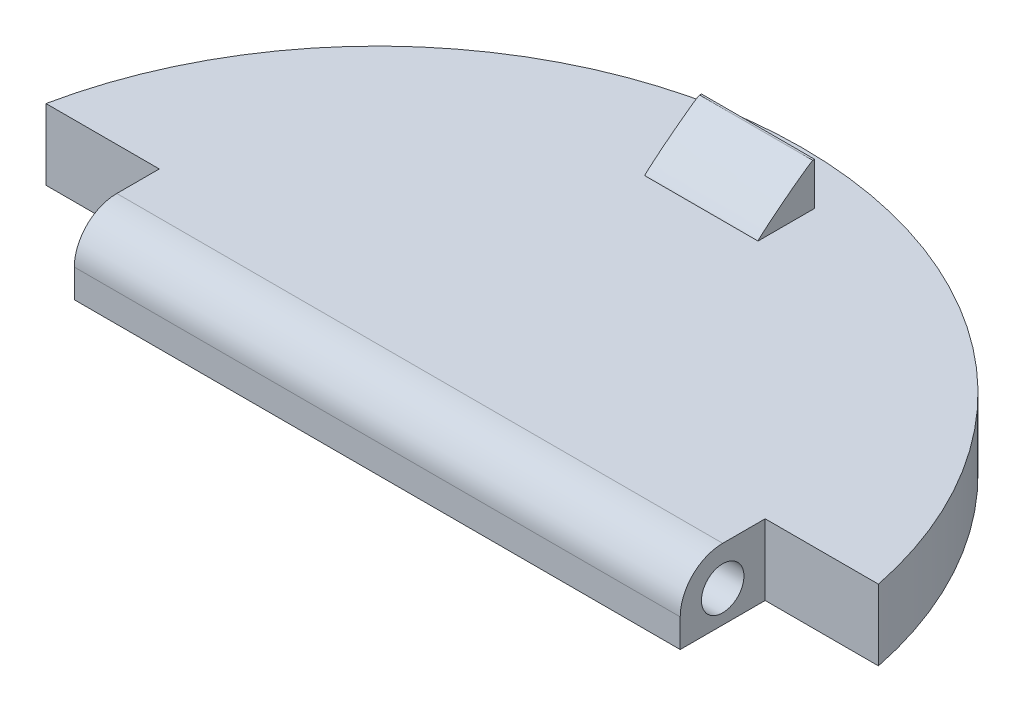
ISO-10303-21;
HEADER;
FILE_DESCRIPTION(('STEP AP214'),'2;1');
FILE_NAME('part.step','',(''),(''),'','','');
FILE_SCHEMA(('AUTOMOTIVE_DESIGN { 1 0 10303 214 1 1 1 1 }'));
ENDSEC;
DATA;
#1=APPLICATION_CONTEXT('core data for automotive mechanical design processes');
#2=APPLICATION_PROTOCOL_DEFINITION('international standard','automotive_design',2000,#1);
#3=PRODUCT_CONTEXT('',#1,'mechanical');
#4=PRODUCT('Part','Part','',(#3));
#5=PRODUCT_RELATED_PRODUCT_CATEGORY('part','',(#4));
#6=PRODUCT_DEFINITION_FORMATION('','',#4);
#7=PRODUCT_DEFINITION_CONTEXT('part definition',#1,'design');
#8=PRODUCT_DEFINITION('design','',#6,#7);
#9=PRODUCT_DEFINITION_SHAPE('','',#8);
#10=(LENGTH_UNIT() NAMED_UNIT(*) SI_UNIT(.MILLI.,.METRE.));
#11=(NAMED_UNIT(*) PLANE_ANGLE_UNIT() SI_UNIT($,.RADIAN.));
#12=(NAMED_UNIT(*) SI_UNIT($,.STERADIAN.) SOLID_ANGLE_UNIT());
#13=UNCERTAINTY_MEASURE_WITH_UNIT(LENGTH_MEASURE(1.E-05),#10,'distance_accuracy_value','');
#14=(GEOMETRIC_REPRESENTATION_CONTEXT(3) GLOBAL_UNCERTAINTY_ASSIGNED_CONTEXT((#13)) GLOBAL_UNIT_ASSIGNED_CONTEXT((#10,
#11,#12)) REPRESENTATION_CONTEXT('',''));
#15=CARTESIAN_POINT('',(0.,0.,0.));
#16=DIRECTION('',(0.,0.,1.));
#17=DIRECTION('',(1.,0.,0.));
#18=AXIS2_PLACEMENT_3D('',#15,#16,#17);
#19=CARTESIAN_POINT('',(0.,5.,0.));
#20=DIRECTION('',(0.,1.,0.));
#21=DIRECTION('',(0.,0.,1.));
#22=AXIS2_PLACEMENT_3D('',#19,#20,#21);
#23=PLANE('',#22);
#24=DIRECTION('',(0.,0.,-1.));
#25=VECTOR('',#24,1.);
#26=CARTESIAN_POINT('',(-21.3938769133982,5.,0.));
#27=LINE('',#26,#25);
#28=CARTESIAN_POINT('',(-21.3938769133982,5.,-3.));
#29=VERTEX_POINT('',#28);
#30=CARTESIAN_POINT('',(-21.3938769133982,5.,-6.));
#31=VERTEX_POINT('',#30);
#32=EDGE_CURVE('E125',#29,#31,#27,.T.);
#33=ORIENTED_EDGE('',*,*,#32,.F.);
#34=DIRECTION('',(1.,0.,0.));
#35=VECTOR('',#34,1.);
#36=CARTESIAN_POINT('',(21.3938769133982,5.,-3.));
#37=LINE('',#36,#35);
#38=CARTESIAN_POINT('',(21.3938769133982,5.,-3.));
#39=VERTEX_POINT('',#38);
#40=EDGE_CURVE('E241',#29,#39,#37,.T.);
#41=ORIENTED_EDGE('',*,*,#40,.T.);
#42=DIRECTION('',(0.,0.,1.));
#43=VECTOR('',#42,1.);
#44=CARTESIAN_POINT('',(21.3938769133982,5.,0.));
#45=LINE('',#44,#43);
#46=CARTESIAN_POINT('',(21.3938769133982,5.,-6.));
#47=VERTEX_POINT('',#46);
#48=EDGE_CURVE('E167',#47,#39,#45,.T.);
#49=ORIENTED_EDGE('',*,*,#48,.F.);
#50=DIRECTION('',(-1.,0.,0.));
#51=VECTOR('',#50,1.);
#52=CARTESIAN_POINT('',(21.3938769133982,5.,-6.));
#53=LINE('',#52,#51);
#54=CARTESIAN_POINT('',(29.3938769133982,5.,-6.));
#55=VERTEX_POINT('',#54);
#56=EDGE_CURVE('E163',#55,#47,#53,.T.);
#57=ORIENTED_EDGE('',*,*,#56,.F.);
#58=CARTESIAN_POINT('',(0.,5.,0.));
#59=DIRECTION('',(0.,1.,0.));
#60=DIRECTION('',(0.,0.,1.));
#61=AXIS2_PLACEMENT_3D('',#58,#59,#60);
#62=CIRCLE('',#61,30.);
#63=CARTESIAN_POINT('',(-29.3938769133982,5.,-6.));
#64=VERTEX_POINT('',#63);
#65=EDGE_CURVE('E153',#55,#64,#62,.T.);
#66=ORIENTED_EDGE('',*,*,#65,.T.);
#67=DIRECTION('',(-1.,0.,0.));
#68=VECTOR('',#67,1.);
#69=CARTESIAN_POINT('',(-21.3938769133982,5.,-6.));
#70=LINE('',#69,#68);
#71=EDGE_CURVE('E136',#31,#64,#70,.T.);
#72=ORIENTED_EDGE('',*,*,#71,.F.);
#73=EDGE_LOOP('',(#33,#41,#49,#57,#66,#72));
#74=FACE_BOUND('',#73,.T.);
#75=DIRECTION('',(-1.,0.,0.));
#76=VECTOR('',#75,1.);
#77=CARTESIAN_POINT('',(-3.84159331598207,5.,-26.7316665793187));
#78=LINE('',#77,#76);
#79=CARTESIAN_POINT('',(4.15840668401793,5.,-26.7316665793187));
#80=VERTEX_POINT('',#79);
#81=CARTESIAN_POINT('',(-3.84159331598207,5.,-26.7316665793187));
#82=VERTEX_POINT('',#81);
#83=EDGE_CURVE('E200',#80,#82,#78,.T.);
#84=ORIENTED_EDGE('',*,*,#83,.F.);
#85=DIRECTION('',(0.,0.,-1.));
#86=VECTOR('',#85,1.);
#87=CARTESIAN_POINT('',(4.15840668401793,5.,-26.7316665793187));
#88=LINE('',#87,#86);
#89=CARTESIAN_POINT('',(4.15840668401793,5.,-22.7316665793187));
#90=VERTEX_POINT('',#89);
#91=EDGE_CURVE('E161',#90,#80,#88,.T.);
#92=ORIENTED_EDGE('',*,*,#91,.F.);
#93=CARTESIAN_POINT('',(-4.24159331598207,5.,-22.7316665793187));
#94=CARTESIAN_POINT('',(-1.30825998264874,5.,-22.7316665793187));
#95=CARTESIAN_POINT('',(1.6250733506846,5.,-22.7316665793187));
#96=CARTESIAN_POINT('',(4.55840668401793,5.,-22.7316665793187));
#97=(BOUNDED_CURVE() B_SPLINE_CURVE(3,(#93,#94,#95,#96),.UNSPECIFIED.,.F.,
.F.) B_SPLINE_CURVE_WITH_KNOTS((4,4),(-0.00455840668401793,0.00424159331598207),
.UNSPECIFIED.) CURVE() GEOMETRIC_REPRESENTATION_ITEM() RATIONAL_B_SPLINE_CURVE((1.,1.,1.,1.)) REPRESENTATION_ITEM(''));
#98=CARTESIAN_POINT('',(-3.84159331598207,5.,-22.7316665793187));
#99=VERTEX_POINT('',#98);
#100=EDGE_CURVE('E188',#99,#90,#97,.T.);
#101=ORIENTED_EDGE('',*,*,#100,.F.);
#102=DIRECTION('',(0.,0.,1.));
#103=VECTOR('',#102,1.);
#104=CARTESIAN_POINT('',(-3.84159331598207,5.,-26.7316665793187));
#105=LINE('',#104,#103);
#106=EDGE_CURVE('E203',#82,#99,#105,.T.);
#107=ORIENTED_EDGE('',*,*,#106,.F.);
#108=EDGE_LOOP('',(#84,#92,#101,#107));
#109=FACE_BOUND('',#108,.T.);
#110=ADVANCED_FACE('F44',(#74,#109),#23,.T.);
#111=CARTESIAN_POINT('',(0.,5.,0.));
#112=DIRECTION('',(0.,-1.,0.));
#113=DIRECTION('',(0.,0.,-1.));
#114=AXIS2_PLACEMENT_3D('',#111,#112,#113);
#115=CYLINDRICAL_SURFACE('',#114,30.);
#116=CARTESIAN_POINT('',(0.,0.,0.));
#117=DIRECTION('',(0.,1.,0.));
#118=DIRECTION('',(0.,0.,1.));
#119=AXIS2_PLACEMENT_3D('',#116,#117,#118);
#120=CIRCLE('',#119,30.);
#121=CARTESIAN_POINT('',(29.3938769133982,0.,-6.));
#122=VERTEX_POINT('',#121);
#123=CARTESIAN_POINT('',(-29.3938769133982,0.,-6.));
#124=VERTEX_POINT('',#123);
#125=EDGE_CURVE('E210',#122,#124,#120,.T.);
#126=ORIENTED_EDGE('',*,*,#125,.T.);
#127=DIRECTION('',(0.,1.,0.));
#128=VECTOR('',#127,1.);
#129=CARTESIAN_POINT('',(-29.3938769133982,-5.,-6.));
#130=LINE('',#129,#128);
#131=EDGE_CURVE('E146',#124,#64,#130,.T.);
#132=ORIENTED_EDGE('',*,*,#131,.T.);
#133=ORIENTED_EDGE('',*,*,#65,.F.);
#134=DIRECTION('',(0.,1.,0.));
#135=VECTOR('',#134,1.);
#136=CARTESIAN_POINT('',(29.3938769133982,-5.,-6.));
#137=LINE('',#136,#135);
#138=EDGE_CURVE('E171',#122,#55,#137,.T.);
#139=ORIENTED_EDGE('',*,*,#138,.F.);
#140=EDGE_LOOP('',(#126,#132,#133,#139));
#141=FACE_BOUND('',#140,.T.);
#142=ADVANCED_FACE('F251',(#141),#115,.T.);
#143=CARTESIAN_POINT('',(-30.,5.,0.));
#144=DIRECTION('',(0.,0.,-1.));
#145=DIRECTION('',(-1.,0.,0.));
#146=AXIS2_PLACEMENT_3D('',#143,#144,#145);
#147=PLANE('',#146);
#148=DIRECTION('',(0.,1.,0.));
#149=VECTOR('',#148,1.);
#150=CARTESIAN_POINT('',(21.3938769133982,-5.,0.));
#151=LINE('',#150,#149);
#152=CARTESIAN_POINT('',(21.3938769133982,0.,0.));
#153=VERTEX_POINT('',#152);
#154=CARTESIAN_POINT('',(21.3938769133982,2.,0.));
#155=VERTEX_POINT('',#154);
#156=EDGE_CURVE('E137',#153,#155,#151,.T.);
#157=ORIENTED_EDGE('',*,*,#156,.T.);
#158=DIRECTION('',(1.,0.,0.));
#159=VECTOR('',#158,1.);
#160=CARTESIAN_POINT('',(-21.3938769133982,2.,0.));
#161=LINE('',#160,#159);
#162=CARTESIAN_POINT('',(-21.3938769133982,2.,0.));
#163=VERTEX_POINT('',#162);
#164=EDGE_CURVE('E52',#155,#163,#161,.F.);
#165=ORIENTED_EDGE('',*,*,#164,.T.);
#166=DIRECTION('',(0.,1.,0.));
#167=VECTOR('',#166,1.);
#168=CARTESIAN_POINT('',(-21.3938769133982,-5.,0.));
#169=LINE('',#168,#167);
#170=CARTESIAN_POINT('',(-21.3938769133982,0.,0.));
#171=VERTEX_POINT('',#170);
#172=EDGE_CURVE('E147',#171,#163,#169,.T.);
#173=ORIENTED_EDGE('',*,*,#172,.F.);
#174=DIRECTION('',(1.,0.,0.));
#175=VECTOR('',#174,1.);
#176=CARTESIAN_POINT('',(-30.,0.,0.));
#177=LINE('',#176,#175);
#178=EDGE_CURVE('E189',#171,#153,#177,.T.);
#179=ORIENTED_EDGE('',*,*,#178,.T.);
#180=EDGE_LOOP('',(#157,#165,#173,#179));
#181=FACE_BOUND('',#180,.T.);
#182=ADVANCED_FACE('F221',(#181),#147,.F.);
#183=CARTESIAN_POINT('',(0.,0.,0.));
#184=DIRECTION('',(0.,1.,0.));
#185=DIRECTION('',(0.,0.,1.));
#186=AXIS2_PLACEMENT_3D('',#183,#184,#185);
#187=PLANE('',#186);
#188=DIRECTION('',(0.,0.,-1.));
#189=VECTOR('',#188,1.);
#190=CARTESIAN_POINT('',(-21.3938769133982,0.,0.));
#191=LINE('',#190,#189);
#192=CARTESIAN_POINT('',(-21.3938769133982,0.,-6.));
#193=VERTEX_POINT('',#192);
#194=EDGE_CURVE('E225',#171,#193,#191,.T.);
#195=ORIENTED_EDGE('',*,*,#194,.T.);
#196=DIRECTION('',(-1.,0.,0.));
#197=VECTOR('',#196,1.);
#198=CARTESIAN_POINT('',(0.,0.,-6.));
#199=LINE('',#198,#197);
#200=EDGE_CURVE('E143',#193,#124,#199,.T.);
#201=ORIENTED_EDGE('',*,*,#200,.T.);
#202=ORIENTED_EDGE('',*,*,#125,.F.);
#203=DIRECTION('',(-1.,0.,0.));
#204=VECTOR('',#203,1.);
#205=CARTESIAN_POINT('',(0.,0.,-6.));
#206=LINE('',#205,#204);
#207=CARTESIAN_POINT('',(21.3938769133982,0.,-6.));
#208=VERTEX_POINT('',#207);
#209=EDGE_CURVE('E229',#122,#208,#206,.T.);
#210=ORIENTED_EDGE('',*,*,#209,.T.);
#211=DIRECTION('',(0.,0.,1.));
#212=VECTOR('',#211,1.);
#213=CARTESIAN_POINT('',(21.3938769133982,0.,0.));
#214=LINE('',#213,#212);
#215=EDGE_CURVE('E228',#208,#153,#214,.T.);
#216=ORIENTED_EDGE('',*,*,#215,.T.);
#217=ORIENTED_EDGE('',*,*,#178,.F.);
#218=EDGE_LOOP('',(#195,#201,#202,#210,#216,#217));
#219=FACE_BOUND('',#218,.T.);
#220=ADVANCED_FACE('F224',(#219),#187,.F.);
#221=CARTESIAN_POINT('',(4.15840668401793,8.,-26.7316665793187));
#222=DIRECTION('',(-1.,0.,0.));
#223=DIRECTION('',(0.,0.,1.));
#224=AXIS2_PLACEMENT_3D('',#221,#222,#223);
#225=PLANE('',#224);
#226=DIRECTION('',(0.,0.,-1.));
#227=VECTOR('',#226,1.);
#228=CARTESIAN_POINT('',(4.15840668401793,8.,-26.7316665793187));
#229=LINE('',#228,#227);
#230=CARTESIAN_POINT('',(4.15840668401793,8.,-26.6046499255261));
#231=VERTEX_POINT('',#230);
#232=CARTESIAN_POINT('',(4.15840668401793,8.,-26.7316665793187));
#233=VERTEX_POINT('',#232);
#234=EDGE_CURVE('E184',#231,#233,#229,.T.);
#235=ORIENTED_EDGE('',*,*,#234,.F.);
#236=CARTESIAN_POINT('',(4.15840668401793,5.,-22.7316665793187));
#237=CARTESIAN_POINT('',(4.15840668401793,8.,-23.5062632485602));
#238=CARTESIAN_POINT('',(4.15840668401793,8.,-26.6046499255261));
#239=(BOUNDED_CURVE() B_SPLINE_CURVE(2,(#236,#237,#238),.UNSPECIFIED.,.F.,
.F.) B_SPLINE_CURVE_WITH_KNOTS((3,3),(0.,1.),
.UNSPECIFIED.) CURVE() GEOMETRIC_REPRESENTATION_ITEM() RATIONAL_B_SPLINE_CURVE((1.,
0.0574959574576069,1.)) REPRESENTATION_ITEM(''));
#240=EDGE_CURVE('E350',#231,#90,#239,.F.);
#241=ORIENTED_EDGE('',*,*,#240,.T.);
#242=ORIENTED_EDGE('',*,*,#91,.T.);
#243=DIRECTION('',(0.,-1.,0.));
#244=VECTOR('',#243,1.);
#245=CARTESIAN_POINT('',(4.15840668401793,8.,-26.7316665793187));
#246=LINE('',#245,#244);
#247=EDGE_CURVE('E207',#233,#80,#246,.T.);
#248=ORIENTED_EDGE('',*,*,#247,.F.);
#249=EDGE_LOOP('',(#235,#241,#242,#248));
#250=FACE_BOUND('',#249,.T.);
#251=ADVANCED_FACE('F333',(#250),#225,.F.);
#252=CARTESIAN_POINT('',(-3.84159331598207,8.,-26.7316665793187));
#253=DIRECTION('',(0.,0.,1.));
#254=DIRECTION('',(1.,0.,0.));
#255=AXIS2_PLACEMENT_3D('',#252,#253,#254);
#256=PLANE('',#255);
#257=ORIENTED_EDGE('',*,*,#83,.T.);
#258=DIRECTION('',(0.,-1.,0.));
#259=VECTOR('',#258,1.);
#260=CARTESIAN_POINT('',(-3.84159331598207,8.,-26.7316665793187));
#261=LINE('',#260,#259);
#262=CARTESIAN_POINT('',(-3.84159331598207,8.,-26.7316665793187));
#263=VERTEX_POINT('',#262);
#264=EDGE_CURVE('E195',#263,#82,#261,.T.);
#265=ORIENTED_EDGE('',*,*,#264,.F.);
#266=DIRECTION('',(-1.,0.,0.));
#267=VECTOR('',#266,1.);
#268=CARTESIAN_POINT('',(-3.84159331598207,8.,-26.7316665793187));
#269=LINE('',#268,#267);
#270=EDGE_CURVE('E181',#233,#263,#269,.T.);
#271=ORIENTED_EDGE('',*,*,#270,.F.);
#272=ORIENTED_EDGE('',*,*,#247,.T.);
#273=EDGE_LOOP('',(#257,#265,#271,#272));
#274=FACE_BOUND('',#273,.T.);
#275=ADVANCED_FACE('F340',(#274),#256,.F.);
#276=CARTESIAN_POINT('',(-3.84159331598207,8.,-26.7316665793187));
#277=DIRECTION('',(1.,0.,0.));
#278=DIRECTION('',(0.,0.,-1.));
#279=AXIS2_PLACEMENT_3D('',#276,#277,#278);
#280=PLANE('',#279);
#281=ORIENTED_EDGE('',*,*,#106,.T.);
#282=CARTESIAN_POINT('',(-3.84159331598207,8.,-26.6046499255261));
#283=CARTESIAN_POINT('',(-3.84159331598207,8.,-23.5062632485602));
#284=CARTESIAN_POINT('',(-3.84159331598207,5.,-22.7316665793187));
#285=(BOUNDED_CURVE() B_SPLINE_CURVE(2,(#282,#283,#284),.UNSPECIFIED.,.F.,
.F.) B_SPLINE_CURVE_WITH_KNOTS((3,3),(0.,1.),
.UNSPECIFIED.) CURVE() GEOMETRIC_REPRESENTATION_ITEM() RATIONAL_B_SPLINE_CURVE((1.,
0.0574959574576069,1.)) REPRESENTATION_ITEM(''));
#286=CARTESIAN_POINT('',(-3.84159331598207,8.,-26.6046499255261));
#287=VERTEX_POINT('',#286);
#288=EDGE_CURVE('E235',#99,#287,#285,.F.);
#289=ORIENTED_EDGE('',*,*,#288,.T.);
#290=DIRECTION('',(0.,0.,1.));
#291=VECTOR('',#290,1.);
#292=CARTESIAN_POINT('',(-3.84159331598207,8.,-26.7316665793187));
#293=LINE('',#292,#291);
#294=EDGE_CURVE('E191',#263,#287,#293,.T.);
#295=ORIENTED_EDGE('',*,*,#294,.F.);
#296=ORIENTED_EDGE('',*,*,#264,.T.);
#297=EDGE_LOOP('',(#281,#289,#295,#296));
#298=FACE_BOUND('',#297,.T.);
#299=ADVANCED_FACE('F345',(#298),#280,.F.);
#300=CARTESIAN_POINT('',(0.,8.,0.));
#301=DIRECTION('',(0.,1.,0.));
#302=DIRECTION('',(0.,0.,1.));
#303=AXIS2_PLACEMENT_3D('',#300,#301,#302);
#304=PLANE('',#303);
#305=ORIENTED_EDGE('',*,*,#294,.T.);
#306=CARTESIAN_POINT('',(4.55840668401793,8.,-26.6046499255261));
#307=CARTESIAN_POINT('',(1.6250733506846,8.,-26.6046499255261));
#308=CARTESIAN_POINT('',(-1.30825998264874,8.,-26.6046499255261));
#309=CARTESIAN_POINT('',(-4.24159331598207,8.,-26.6046499255261));
#310=(BOUNDED_CURVE() B_SPLINE_CURVE(3,(#306,#307,#308,#309),.UNSPECIFIED.,.F.,
.F.) B_SPLINE_CURVE_WITH_KNOTS((4,4),(-0.00455840668401793,0.00424159331598207),
.UNSPECIFIED.) CURVE() GEOMETRIC_REPRESENTATION_ITEM() RATIONAL_B_SPLINE_CURVE((1.,1.,1.,1.)) REPRESENTATION_ITEM(''));
#311=EDGE_CURVE('E212',#287,#231,#310,.F.);
#312=ORIENTED_EDGE('',*,*,#311,.T.);
#313=ORIENTED_EDGE('',*,*,#234,.T.);
#314=ORIENTED_EDGE('',*,*,#270,.T.);
#315=EDGE_LOOP('',(#305,#312,#313,#314));
#316=FACE_BOUND('',#315,.T.);
#317=ADVANCED_FACE('F271',(#316),#304,.T.);
#318=CARTESIAN_POINT('',(4.55840668401793,5.,-22.7316665793187));
#319=CARTESIAN_POINT('',(1.6250733506846,5.,-22.7316665793187));
#320=CARTESIAN_POINT('',(-1.30825998264874,5.,-22.7316665793187));
#321=CARTESIAN_POINT('',(-4.24159331598207,5.,-22.7316665793187));
#322=CARTESIAN_POINT('',(4.55840668401793,8.,-23.5062632485602));
#323=CARTESIAN_POINT('',(1.6250733506846,8.,-23.5062632485602));
#324=CARTESIAN_POINT('',(-1.30825998264874,8.,-23.5062632485602));
#325=CARTESIAN_POINT('',(-4.24159331598207,8.,-23.5062632485602));
#326=CARTESIAN_POINT('',(4.55840668401793,8.,-26.6046499255261));
#327=CARTESIAN_POINT('',(1.6250733506846,8.,-26.6046499255261));
#328=CARTESIAN_POINT('',(-1.30825998264874,8.,-26.6046499255261));
#329=CARTESIAN_POINT('',(-4.24159331598207,8.,-26.6046499255261));
#330=(BOUNDED_SURFACE() B_SPLINE_SURFACE(2,3,((#318,#319,#320,#321),(#322,#323,#324,#325),(#326,
#327,#328,#329)),.UNSPECIFIED.,.F.,.F.,.F.) B_SPLINE_SURFACE_WITH_KNOTS((3,3),(4,4),(0.,1.),
(-0.00455840668401793,0.00424159331598207),
.UNSPECIFIED.) GEOMETRIC_REPRESENTATION_ITEM() RATIONAL_B_SPLINE_SURFACE(((1.,1.,1.,1.),
(0.0574959574576069,0.0574959574576069,0.0574959574576069,0.0574959574576069),(1.,1.,1.,1.))) REPRESENTATION_ITEM('') SURFACE());
#331=ORIENTED_EDGE('',*,*,#288,.F.);
#332=ORIENTED_EDGE('',*,*,#100,.T.);
#333=ORIENTED_EDGE('',*,*,#240,.F.);
#334=ORIENTED_EDGE('',*,*,#311,.F.);
#335=EDGE_LOOP('',(#331,#332,#333,#334));
#336=FACE_BOUND('',#335,.T.);
#337=ADVANCED_FACE('F264',(#336),#330,.T.);
#338=CARTESIAN_POINT('',(21.3938769133982,-5.,0.));
#339=DIRECTION('',(-1.,0.,0.));
#340=DIRECTION('',(0.,0.,1.));
#341=AXIS2_PLACEMENT_3D('',#338,#339,#340);
#342=PLANE('',#341);
#343=CARTESIAN_POINT('',(21.3938769133982,2.25,-3.));
#344=DIRECTION('',(1.,0.,0.));
#345=DIRECTION('',(0.,0.,-1.));
#346=AXIS2_PLACEMENT_3D('',#343,#344,#345);
#347=CIRCLE('',#346,1.5);
#348=CARTESIAN_POINT('',(21.3938769133982,2.25,-4.5));
#349=VERTEX_POINT('',#348);
#350=EDGE_CURVE('E415',#349,#349,#347,.T.);
#351=ORIENTED_EDGE('',*,*,#350,.F.);
#352=EDGE_LOOP('',(#351));
#353=FACE_BOUND('',#352,.T.);
#354=ORIENTED_EDGE('',*,*,#48,.T.);
#355=CARTESIAN_POINT('',(21.3938769133982,2.,-3.));
#356=DIRECTION('',(-1.,0.,0.));
#357=DIRECTION('',(0.,0.,1.));
#358=AXIS2_PLACEMENT_3D('',#355,#356,#357);
#359=CIRCLE('',#358,3.);
#360=EDGE_CURVE('E66',#39,#155,#359,.F.);
#361=ORIENTED_EDGE('',*,*,#360,.T.);
#362=ORIENTED_EDGE('',*,*,#156,.F.);
#363=ORIENTED_EDGE('',*,*,#215,.F.);
#364=DIRECTION('',(0.,1.,0.));
#365=VECTOR('',#364,1.);
#366=CARTESIAN_POINT('',(21.3938769133982,-5.,-6.));
#367=LINE('',#366,#365);
#368=EDGE_CURVE('E174',#208,#47,#367,.T.);
#369=ORIENTED_EDGE('',*,*,#368,.T.);
#370=EDGE_LOOP('',(#354,#361,#362,#363,#369));
#371=FACE_BOUND('',#370,.T.);
#372=ADVANCED_FACE('F248',(#353,#371),#342,.F.);
#373=CARTESIAN_POINT('',(21.3938769133982,-5.,-6.));
#374=DIRECTION('',(0.,0.,-1.));
#375=DIRECTION('',(-1.,0.,0.));
#376=AXIS2_PLACEMENT_3D('',#373,#374,#375);
#377=PLANE('',#376);
#378=ORIENTED_EDGE('',*,*,#138,.T.);
#379=ORIENTED_EDGE('',*,*,#56,.T.);
#380=ORIENTED_EDGE('',*,*,#368,.F.);
#381=ORIENTED_EDGE('',*,*,#209,.F.);
#382=EDGE_LOOP('',(#378,#379,#380,#381));
#383=FACE_BOUND('',#382,.T.);
#384=ADVANCED_FACE('F250',(#383),#377,.F.);
#385=CARTESIAN_POINT('',(-21.3938769133982,-5.,-6.));
#386=DIRECTION('',(0.,0.,-1.));
#387=DIRECTION('',(-1.,0.,0.));
#388=AXIS2_PLACEMENT_3D('',#385,#386,#387);
#389=PLANE('',#388);
#390=DIRECTION('',(0.,1.,0.));
#391=VECTOR('',#390,1.);
#392=CARTESIAN_POINT('',(-21.3938769133982,-5.,-6.));
#393=LINE('',#392,#391);
#394=EDGE_CURVE('E128',#193,#31,#393,.T.);
#395=ORIENTED_EDGE('',*,*,#394,.T.);
#396=ORIENTED_EDGE('',*,*,#71,.T.);
#397=ORIENTED_EDGE('',*,*,#131,.F.);
#398=ORIENTED_EDGE('',*,*,#200,.F.);
#399=EDGE_LOOP('',(#395,#396,#397,#398));
#400=FACE_BOUND('',#399,.T.);
#401=ADVANCED_FACE('F140',(#400),#389,.F.);
#402=CARTESIAN_POINT('',(-21.3938769133982,-5.,0.));
#403=DIRECTION('',(1.,0.,0.));
#404=DIRECTION('',(0.,0.,-1.));
#405=AXIS2_PLACEMENT_3D('',#402,#403,#404);
#406=PLANE('',#405);
#407=ORIENTED_EDGE('',*,*,#172,.T.);
#408=CARTESIAN_POINT('',(-21.3938769133982,2.,-3.));
#409=DIRECTION('',(1.,0.,0.));
#410=DIRECTION('',(0.,0.,-1.));
#411=AXIS2_PLACEMENT_3D('',#408,#409,#410);
#412=CIRCLE('',#411,3.);
#413=EDGE_CURVE('E12',#163,#29,#412,.F.);
#414=ORIENTED_EDGE('',*,*,#413,.T.);
#415=ORIENTED_EDGE('',*,*,#32,.T.);
#416=ORIENTED_EDGE('',*,*,#394,.F.);
#417=ORIENTED_EDGE('',*,*,#194,.F.);
#418=EDGE_LOOP('',(#407,#414,#415,#416,#417));
#419=FACE_BOUND('',#418,.T.);
#420=ADVANCED_FACE('F127',(#419),#406,.F.);
#421=CARTESIAN_POINT('',(0.,2.,-3.));
#422=DIRECTION('',(-1.,0.,0.));
#423=DIRECTION('',(0.,0.,1.));
#424=AXIS2_PLACEMENT_3D('',#421,#422,#423);
#425=CYLINDRICAL_SURFACE('',#424,3.);
#426=ORIENTED_EDGE('',*,*,#413,.F.);
#427=ORIENTED_EDGE('',*,*,#164,.F.);
#428=ORIENTED_EDGE('',*,*,#360,.F.);
#429=ORIENTED_EDGE('',*,*,#40,.F.);
#430=EDGE_LOOP('',(#426,#427,#428,#429));
#431=FACE_BOUND('',#430,.T.);
#432=ADVANCED_FACE('F46',(#431),#425,.T.);
#433=CARTESIAN_POINT('',(16.3938769133982,2.25,-3.));
#434=DIRECTION('',(1.,0.,0.));
#435=DIRECTION('',(0.,0.,-1.));
#436=AXIS2_PLACEMENT_3D('',#433,#434,#435);
#437=CYLINDRICAL_SURFACE('',#436,1.5);
#438=CARTESIAN_POINT('',(16.3938769133982,2.25,-3.));
#439=DIRECTION('',(1.,0.,0.));
#440=DIRECTION('',(0.,0.,-1.));
#441=AXIS2_PLACEMENT_3D('',#438,#439,#440);
#442=CIRCLE('',#441,1.5);
#443=CARTESIAN_POINT('',(16.3938769133982,2.25,-4.5));
#444=VERTEX_POINT('',#443);
#445=EDGE_CURVE('E168',#444,#444,#442,.T.);
#446=ORIENTED_EDGE('',*,*,#445,.F.);
#447=EDGE_LOOP('',(#446));
#448=FACE_BOUND('',#447,.T.);
#449=ORIENTED_EDGE('',*,*,#350,.T.);
#450=EDGE_LOOP('',(#449));
#451=FACE_BOUND('',#450,.T.);
#452=ADVANCED_FACE('F403',(#448,#451),#437,.F.);
#453=CARTESIAN_POINT('',(16.3938769133982,2.25,-3.));
#454=DIRECTION('',(1.,0.,0.));
#455=DIRECTION('',(0.,0.,-1.));
#456=AXIS2_PLACEMENT_3D('',#453,#454,#455);
#457=PLANE('',#456);
#458=ORIENTED_EDGE('',*,*,#445,.T.);
#459=EDGE_LOOP('',(#458));
#460=FACE_BOUND('',#459,.T.);
#461=ADVANCED_FACE('F406',(#460),#457,.T.);
#462=CLOSED_SHELL('',(#110,#142,#182,#220,#251,#275,#299,#317,#337,#372,#384,#401,#420,#432,
#452,#461));
#463=MANIFOLD_SOLID_BREP('B2',#462);
#464=ADVANCED_BREP_SHAPE_REPRESENTATION('',(#18,#463),#14);
#465=SHAPE_DEFINITION_REPRESENTATION(#9,#464);
ENDSEC;
END-ISO-10303-21;
